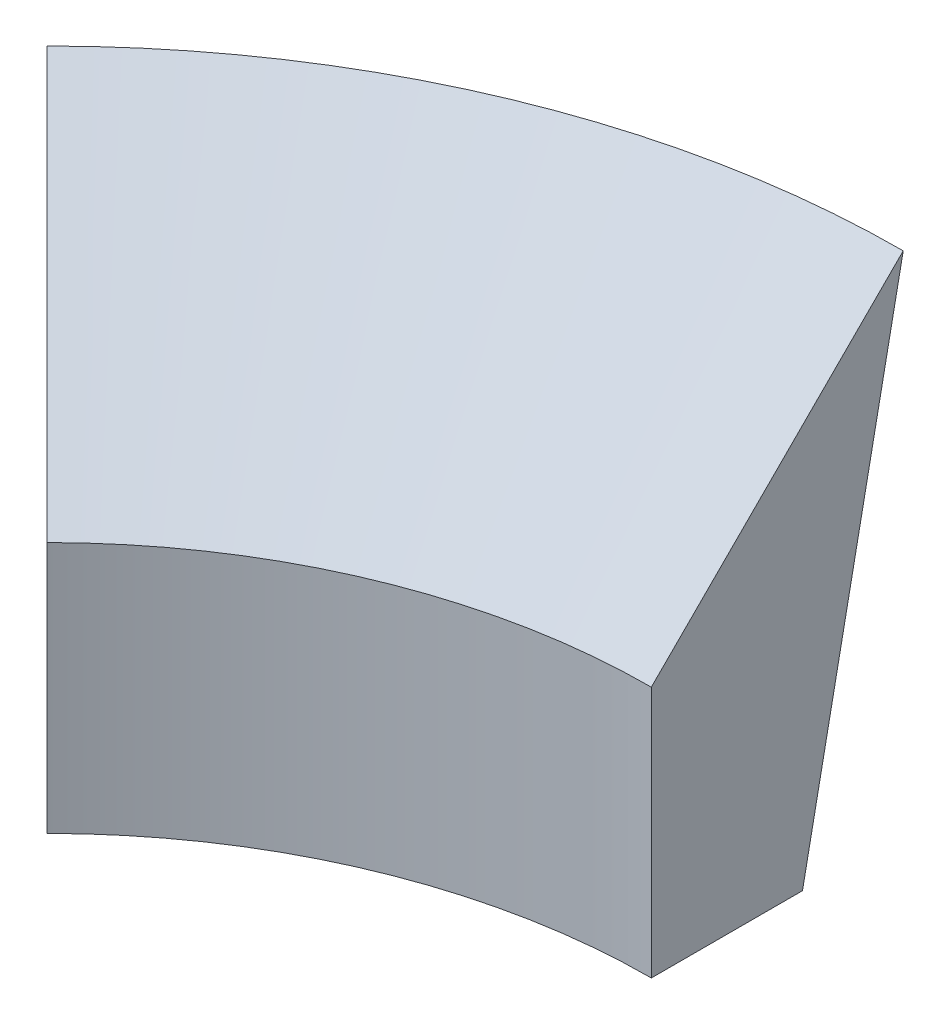
ISO-10303-21;
HEADER;
FILE_DESCRIPTION(('STEP AP214'),'2;1');
FILE_NAME('part.step','',(''),(''),'','','');
FILE_SCHEMA(('AUTOMOTIVE_DESIGN { 1 0 10303 214 1 1 1 1 }'));
ENDSEC;
DATA;
#1=APPLICATION_CONTEXT('core data for automotive mechanical design processes');
#2=APPLICATION_PROTOCOL_DEFINITION('international standard','automotive_design',2000,#1);
#3=PRODUCT_CONTEXT('',#1,'mechanical');
#4=PRODUCT('Part','Part','',(#3));
#5=PRODUCT_RELATED_PRODUCT_CATEGORY('part','',(#4));
#6=PRODUCT_DEFINITION_FORMATION('','',#4);
#7=PRODUCT_DEFINITION_CONTEXT('part definition',#1,'design');
#8=PRODUCT_DEFINITION('design','',#6,#7);
#9=PRODUCT_DEFINITION_SHAPE('','',#8);
#10=(LENGTH_UNIT() NAMED_UNIT(*) SI_UNIT(.MILLI.,.METRE.));
#11=(NAMED_UNIT(*) PLANE_ANGLE_UNIT() SI_UNIT($,.RADIAN.));
#12=(NAMED_UNIT(*) SI_UNIT($,.STERADIAN.) SOLID_ANGLE_UNIT());
#13=UNCERTAINTY_MEASURE_WITH_UNIT(LENGTH_MEASURE(1.E-05),#10,'distance_accuracy_value','');
#14=(GEOMETRIC_REPRESENTATION_CONTEXT(3) GLOBAL_UNCERTAINTY_ASSIGNED_CONTEXT((#13)) GLOBAL_UNIT_ASSIGNED_CONTEXT((#10,
#11,#12)) REPRESENTATION_CONTEXT('',''));
#15=CARTESIAN_POINT('',(0.,0.,0.));
#16=DIRECTION('',(0.,0.,1.));
#17=DIRECTION('',(1.,0.,0.));
#18=AXIS2_PLACEMENT_3D('',#15,#16,#17);
#19=CARTESIAN_POINT('',(0.,0.,0.));
#20=DIRECTION('',(0.,1.,0.));
#21=DIRECTION('',(-1.,0.,0.));
#22=AXIS2_PLACEMENT_3D('',#19,#20,#21);
#23=CYLINDRICAL_SURFACE('',#22,120.);
#24=CARTESIAN_POINT('',(0.,0.,0.));
#25=DIRECTION('',(0.,1.,0.));
#26=DIRECTION('',(-1.,0.,0.));
#27=AXIS2_PLACEMENT_3D('',#24,#25,#26);
#28=CIRCLE('',#27,120.);
#29=CARTESIAN_POINT('',(0.,0.,-120.));
#30=VERTEX_POINT('',#29);
#31=CARTESIAN_POINT('',(-84.8528137423859,0.,-84.8528137423855));
#32=VERTEX_POINT('',#31);
#33=EDGE_CURVE('E93',#30,#32,#28,.T.);
#34=ORIENTED_EDGE('',*,*,#33,.T.);
#35=DIRECTION('',(0.,1.,0.));
#36=VECTOR('',#35,1.);
#37=CARTESIAN_POINT('',(-84.8528137423858,0.,-84.8528137423855));
#38=LINE('',#37,#36);
#39=CARTESIAN_POINT('',(-84.8528137423858,-50.0000000000002,-84.8528137423855));
#40=VERTEX_POINT('',#39);
#41=EDGE_CURVE('E75',#32,#40,#38,.F.);
#42=ORIENTED_EDGE('',*,*,#41,.T.);
#43=CARTESIAN_POINT('',(0.,-50.0000000000002,0.));
#44=DIRECTION('',(0.,1.,0.));
#45=DIRECTION('',(-1.,0.,0.));
#46=AXIS2_PLACEMENT_3D('',#43,#44,#45);
#47=CIRCLE('',#46,120.);
#48=CARTESIAN_POINT('',(0.,-50.0000000000002,-120.));
#49=VERTEX_POINT('',#48);
#50=EDGE_CURVE('E96',#49,#40,#47,.T.);
#51=ORIENTED_EDGE('',*,*,#50,.F.);
#52=DIRECTION('',(0.,1.,0.));
#53=VECTOR('',#52,1.);
#54=CARTESIAN_POINT('',(0.,0.,-120.));
#55=LINE('',#54,#53);
#56=EDGE_CURVE('E56',#30,#49,#55,.F.);
#57=ORIENTED_EDGE('',*,*,#56,.F.);
#58=EDGE_LOOP('',(#34,#42,#51,#57));
#59=FACE_BOUND('',#58,.T.);
#60=ADVANCED_FACE('F35',(#59),#23,.F.);
#61=CARTESIAN_POINT('',(0.,49.9999999999998,0.));
#62=DIRECTION('',(0.,1.,0.));
#63=DIRECTION('',(-1.,0.,0.));
#64=AXIS2_PLACEMENT_3D('',#61,#62,#63);
#65=CONICAL_SURFACE('',#64,170.,0.78539816339745);
#66=CARTESIAN_POINT('',(0.,49.9999999999998,0.));
#67=DIRECTION('',(0.,1.,0.));
#68=DIRECTION('',(-1.,0.,0.));
#69=AXIS2_PLACEMENT_3D('',#66,#67,#68);
#70=CIRCLE('',#69,170.);
#71=CARTESIAN_POINT('',(0.,49.9999999999998,-170.));
#72=VERTEX_POINT('',#71);
#73=CARTESIAN_POINT('',(-120.208152801713,49.9999999999998,-120.208152801713));
#74=VERTEX_POINT('',#73);
#75=EDGE_CURVE('E86',#72,#74,#70,.T.);
#76=ORIENTED_EDGE('',*,*,#75,.T.);
#77=DIRECTION('',(-0.500000000000002,0.707106781186546,-0.5));
#78=VECTOR('',#77,1.);
#79=CARTESIAN_POINT('',(0.,-119.999999999999,0.));
#80=LINE('',#79,#78);
#81=EDGE_CURVE('E72',#74,#32,#80,.F.);
#82=ORIENTED_EDGE('',*,*,#81,.T.);
#83=ORIENTED_EDGE('',*,*,#33,.F.);
#84=DIRECTION('',(0.,0.707106781186546,-0.707106781186549));
#85=VECTOR('',#84,1.);
#86=CARTESIAN_POINT('',(0.,-119.999999999999,0.));
#87=LINE('',#86,#85);
#88=EDGE_CURVE('E92',#72,#30,#87,.F.);
#89=ORIENTED_EDGE('',*,*,#88,.F.);
#90=EDGE_LOOP('',(#76,#82,#83,#89));
#91=FACE_BOUND('',#90,.T.);
#92=ADVANCED_FACE('F91',(#91),#65,.F.);
#93=CARTESIAN_POINT('',(0.,-50.0000000000002,0.));
#94=DIRECTION('',(0.,1.,0.));
#95=DIRECTION('',(-1.,0.,0.));
#96=AXIS2_PLACEMENT_3D('',#93,#94,#95);
#97=CONICAL_SURFACE('',#96,150.,0.197395559849881);
#98=CARTESIAN_POINT('',(0.,-50.0000000000002,0.));
#99=DIRECTION('',(0.,1.,0.));
#100=DIRECTION('',(-1.,0.,0.));
#101=AXIS2_PLACEMENT_3D('',#98,#99,#100);
#102=CIRCLE('',#101,150.);
#103=CARTESIAN_POINT('',(0.,-50.0000000000002,-150.));
#104=VERTEX_POINT('',#103);
#105=CARTESIAN_POINT('',(-106.066017177982,-50.0000000000002,-106.066017177982));
#106=VERTEX_POINT('',#105);
#107=EDGE_CURVE('E88',#104,#106,#102,.T.);
#108=ORIENTED_EDGE('',*,*,#107,.T.);
#109=DIRECTION('',(-0.138675049056308,0.98058067569092,-0.138675049056307));
#110=VECTOR('',#109,1.);
#111=CARTESIAN_POINT('',(0.,-799.999999999999,0.));
#112=LINE('',#111,#110);
#113=EDGE_CURVE('E48',#106,#74,#112,.T.);
#114=ORIENTED_EDGE('',*,*,#113,.T.);
#115=ORIENTED_EDGE('',*,*,#75,.F.);
#116=DIRECTION('',(0.,0.98058067569092,-0.196116135138184));
#117=VECTOR('',#116,1.);
#118=CARTESIAN_POINT('',(0.,-799.999999999999,0.));
#119=LINE('',#118,#117);
#120=EDGE_CURVE('E108',#104,#72,#119,.T.);
#121=ORIENTED_EDGE('',*,*,#120,.F.);
#122=EDGE_LOOP('',(#108,#114,#115,#121));
#123=FACE_BOUND('',#122,.T.);
#124=ADVANCED_FACE('F84',(#123),#97,.T.);
#125=CARTESIAN_POINT('',(0.,-50.0000000000002,0.));
#126=DIRECTION('',(0.,-1.,0.));
#127=DIRECTION('',(1.,0.,0.));
#128=AXIS2_PLACEMENT_3D('',#125,#126,#127);
#129=PLANE('',#128);
#130=DIRECTION('',(0.707106781186549,0.,0.707106781186546));
#131=VECTOR('',#130,1.);
#132=CARTESIAN_POINT('',(0.,-50.0000000000002,0.));
#133=LINE('',#132,#131);
#134=EDGE_CURVE('E11',#106,#40,#133,.T.);
#135=ORIENTED_EDGE('',*,*,#134,.F.);
#136=ORIENTED_EDGE('',*,*,#107,.F.);
#137=DIRECTION('',(0.,0.,1.));
#138=VECTOR('',#137,1.);
#139=CARTESIAN_POINT('',(0.,-50.0000000000002,0.));
#140=LINE('',#139,#138);
#141=EDGE_CURVE('E42',#104,#49,#140,.T.);
#142=ORIENTED_EDGE('',*,*,#141,.T.);
#143=ORIENTED_EDGE('',*,*,#50,.T.);
#144=EDGE_LOOP('',(#135,#136,#142,#143));
#145=FACE_BOUND('',#144,.T.);
#146=ADVANCED_FACE('F102',(#145),#129,.T.);
#147=CARTESIAN_POINT('',(0.,-50.0000000000002,0.));
#148=DIRECTION('',(1.,0.,0.));
#149=DIRECTION('',(0.,0.,-1.));
#150=AXIS2_PLACEMENT_3D('',#147,#148,#149);
#151=PLANE('',#150);
#152=ORIENTED_EDGE('',*,*,#56,.T.);
#153=ORIENTED_EDGE('',*,*,#141,.F.);
#154=ORIENTED_EDGE('',*,*,#120,.T.);
#155=ORIENTED_EDGE('',*,*,#88,.T.);
#156=EDGE_LOOP('',(#152,#153,#154,#155));
#157=FACE_BOUND('',#156,.T.);
#158=ADVANCED_FACE('F109',(#157),#151,.T.);
#159=CARTESIAN_POINT('',(0.,-50.0000000000002,0.));
#160=DIRECTION('',(0.707106781186546,0.,-0.707106781186549));
#161=DIRECTION('',(-0.707106781186549,0.,-0.707106781186546));
#162=AXIS2_PLACEMENT_3D('',#159,#160,#161);
#163=PLANE('',#162);
#164=ORIENTED_EDGE('',*,*,#81,.F.);
#165=ORIENTED_EDGE('',*,*,#113,.F.);
#166=ORIENTED_EDGE('',*,*,#134,.T.);
#167=ORIENTED_EDGE('',*,*,#41,.F.);
#168=EDGE_LOOP('',(#164,#165,#166,#167));
#169=FACE_BOUND('',#168,.T.);
#170=ADVANCED_FACE('F73',(#169),#163,.F.);
#171=CLOSED_SHELL('',(#60,#92,#124,#146,#158,#170));
#172=MANIFOLD_SOLID_BREP('B2',#171);
#173=ADVANCED_BREP_SHAPE_REPRESENTATION('',(#18,#172),#14);
#174=SHAPE_DEFINITION_REPRESENTATION(#9,#173);
ENDSEC;
END-ISO-10303-21;
